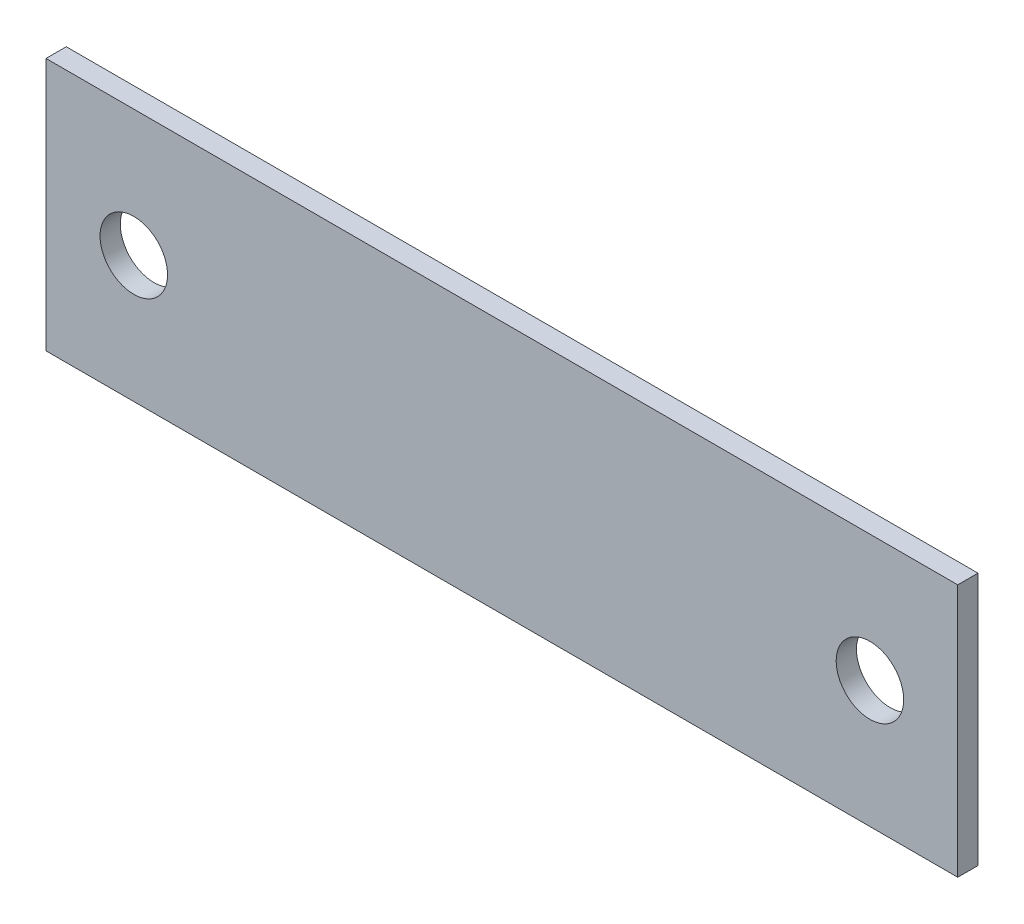
ISO-10303-21;
HEADER;
FILE_DESCRIPTION(('STEP AP214'),'2;1');
FILE_NAME('part.step','',(''),(''),'','','');
FILE_SCHEMA(('AUTOMOTIVE_DESIGN { 1 0 10303 214 1 1 1 1 }'));
ENDSEC;
DATA;
#1=APPLICATION_CONTEXT('core data for automotive mechanical design processes');
#2=APPLICATION_PROTOCOL_DEFINITION('international standard','automotive_design',2000,#1);
#3=PRODUCT_CONTEXT('',#1,'mechanical');
#4=PRODUCT('Part','Part','',(#3));
#5=PRODUCT_RELATED_PRODUCT_CATEGORY('part','',(#4));
#6=PRODUCT_DEFINITION_FORMATION('','',#4);
#7=PRODUCT_DEFINITION_CONTEXT('part definition',#1,'design');
#8=PRODUCT_DEFINITION('design','',#6,#7);
#9=PRODUCT_DEFINITION_SHAPE('','',#8);
#10=(LENGTH_UNIT() NAMED_UNIT(*) SI_UNIT(.MILLI.,.METRE.));
#11=(NAMED_UNIT(*) PLANE_ANGLE_UNIT() SI_UNIT($,.RADIAN.));
#12=(NAMED_UNIT(*) SI_UNIT($,.STERADIAN.) SOLID_ANGLE_UNIT());
#13=UNCERTAINTY_MEASURE_WITH_UNIT(LENGTH_MEASURE(1.E-05),#10,'distance_accuracy_value','');
#14=(GEOMETRIC_REPRESENTATION_CONTEXT(3) GLOBAL_UNCERTAINTY_ASSIGNED_CONTEXT((#13)) GLOBAL_UNIT_ASSIGNED_CONTEXT((#10,
#11,#12)) REPRESENTATION_CONTEXT('',''));
#15=CARTESIAN_POINT('',(0.,0.,0.));
#16=DIRECTION('',(0.,0.,1.));
#17=DIRECTION('',(1.,0.,0.));
#18=AXIS2_PLACEMENT_3D('',#15,#16,#17);
#19=CARTESIAN_POINT('',(27.,-7.5,1.2));
#20=DIRECTION('',(-1.,0.,0.));
#21=DIRECTION('',(0.,0.,1.));
#22=AXIS2_PLACEMENT_3D('',#19,#20,#21);
#23=PLANE('',#22);
#24=DIRECTION('',(0.,1.,0.));
#25=VECTOR('',#24,1.);
#26=CARTESIAN_POINT('',(27.,-7.5,0.));
#27=LINE('',#26,#25);
#28=CARTESIAN_POINT('',(27.,-7.5,0.));
#29=VERTEX_POINT('',#28);
#30=CARTESIAN_POINT('',(27.,7.5,0.));
#31=VERTEX_POINT('',#30);
#32=EDGE_CURVE('E110',#29,#31,#27,.T.);
#33=ORIENTED_EDGE('',*,*,#32,.T.);
#34=DIRECTION('',(0.,0.,-1.));
#35=VECTOR('',#34,1.);
#36=CARTESIAN_POINT('',(27.,7.5,1.2));
#37=LINE('',#36,#35);
#38=CARTESIAN_POINT('',(27.,7.5,1.2));
#39=VERTEX_POINT('',#38);
#40=EDGE_CURVE('E11',#39,#31,#37,.T.);
#41=ORIENTED_EDGE('',*,*,#40,.F.);
#42=DIRECTION('',(0.,1.,0.));
#43=VECTOR('',#42,1.);
#44=CARTESIAN_POINT('',(27.,-7.5,1.2));
#45=LINE('',#44,#43);
#46=CARTESIAN_POINT('',(27.,-7.5,1.2));
#47=VERTEX_POINT('',#46);
#48=EDGE_CURVE('E93',#47,#39,#45,.T.);
#49=ORIENTED_EDGE('',*,*,#48,.F.);
#50=DIRECTION('',(0.,0.,-1.));
#51=VECTOR('',#50,1.);
#52=CARTESIAN_POINT('',(27.,-7.5,1.2));
#53=LINE('',#52,#51);
#54=EDGE_CURVE('E106',#47,#29,#53,.T.);
#55=ORIENTED_EDGE('',*,*,#54,.T.);
#56=EDGE_LOOP('',(#33,#41,#49,#55));
#57=FACE_BOUND('',#56,.T.);
#58=ADVANCED_FACE('F39',(#57),#23,.F.);
#59=CARTESIAN_POINT('',(-27.,7.5,1.2));
#60=DIRECTION('',(0.,-1.,0.));
#61=DIRECTION('',(0.,0.,-1.));
#62=AXIS2_PLACEMENT_3D('',#59,#60,#61);
#63=PLANE('',#62);
#64=DIRECTION('',(-1.,0.,0.));
#65=VECTOR('',#64,1.);
#66=CARTESIAN_POINT('',(-27.,7.5,0.));
#67=LINE('',#66,#65);
#68=CARTESIAN_POINT('',(-27.,7.5,0.));
#69=VERTEX_POINT('',#68);
#70=EDGE_CURVE('E98',#31,#69,#67,.T.);
#71=ORIENTED_EDGE('',*,*,#70,.T.);
#72=DIRECTION('',(0.,0.,-1.));
#73=VECTOR('',#72,1.);
#74=CARTESIAN_POINT('',(-27.,7.5,1.2));
#75=LINE('',#74,#73);
#76=CARTESIAN_POINT('',(-27.,7.5,1.2));
#77=VERTEX_POINT('',#76);
#78=EDGE_CURVE('E49',#77,#69,#75,.T.);
#79=ORIENTED_EDGE('',*,*,#78,.F.);
#80=DIRECTION('',(-1.,0.,0.));
#81=VECTOR('',#80,1.);
#82=CARTESIAN_POINT('',(-27.,7.5,1.2));
#83=LINE('',#82,#81);
#84=EDGE_CURVE('E88',#39,#77,#83,.T.);
#85=ORIENTED_EDGE('',*,*,#84,.F.);
#86=ORIENTED_EDGE('',*,*,#40,.T.);
#87=EDGE_LOOP('',(#71,#79,#85,#86));
#88=FACE_BOUND('',#87,.T.);
#89=ADVANCED_FACE('F97',(#88),#63,.F.);
#90=CARTESIAN_POINT('',(-27.,-7.5,1.2));
#91=DIRECTION('',(1.,0.,0.));
#92=DIRECTION('',(0.,0.,-1.));
#93=AXIS2_PLACEMENT_3D('',#90,#91,#92);
#94=PLANE('',#93);
#95=DIRECTION('',(0.,-1.,0.));
#96=VECTOR('',#95,1.);
#97=CARTESIAN_POINT('',(-27.,-7.5,0.));
#98=LINE('',#97,#96);
#99=CARTESIAN_POINT('',(-27.,-7.5,0.));
#100=VERTEX_POINT('',#99);
#101=EDGE_CURVE('E75',#69,#100,#98,.T.);
#102=ORIENTED_EDGE('',*,*,#101,.T.);
#103=DIRECTION('',(0.,0.,-1.));
#104=VECTOR('',#103,1.);
#105=CARTESIAN_POINT('',(-27.,-7.5,1.2));
#106=LINE('',#105,#104);
#107=CARTESIAN_POINT('',(-27.,-7.5,1.2));
#108=VERTEX_POINT('',#107);
#109=EDGE_CURVE('E100',#108,#100,#106,.T.);
#110=ORIENTED_EDGE('',*,*,#109,.F.);
#111=DIRECTION('',(0.,-1.,0.));
#112=VECTOR('',#111,1.);
#113=CARTESIAN_POINT('',(-27.,-7.5,1.2));
#114=LINE('',#113,#112);
#115=EDGE_CURVE('E91',#77,#108,#114,.T.);
#116=ORIENTED_EDGE('',*,*,#115,.F.);
#117=ORIENTED_EDGE('',*,*,#78,.T.);
#118=EDGE_LOOP('',(#102,#110,#116,#117));
#119=FACE_BOUND('',#118,.T.);
#120=ADVANCED_FACE('F102',(#119),#94,.F.);
#121=CARTESIAN_POINT('',(-27.,-7.5,1.2));
#122=DIRECTION('',(0.,1.,0.));
#123=DIRECTION('',(0.,0.,1.));
#124=AXIS2_PLACEMENT_3D('',#121,#122,#123);
#125=PLANE('',#124);
#126=DIRECTION('',(1.,0.,0.));
#127=VECTOR('',#126,1.);
#128=CARTESIAN_POINT('',(-27.,-7.5,0.));
#129=LINE('',#128,#127);
#130=EDGE_CURVE('E81',#100,#29,#129,.T.);
#131=ORIENTED_EDGE('',*,*,#130,.T.);
#132=ORIENTED_EDGE('',*,*,#54,.F.);
#133=DIRECTION('',(1.,0.,0.));
#134=VECTOR('',#133,1.);
#135=CARTESIAN_POINT('',(-27.,-7.5,1.2));
#136=LINE('',#135,#134);
#137=EDGE_CURVE('E58',#108,#47,#136,.T.);
#138=ORIENTED_EDGE('',*,*,#137,.F.);
#139=ORIENTED_EDGE('',*,*,#109,.T.);
#140=EDGE_LOOP('',(#131,#132,#138,#139));
#141=FACE_BOUND('',#140,.T.);
#142=ADVANCED_FACE('F148',(#141),#125,.F.);
#143=CARTESIAN_POINT('',(0.,0.,1.2));
#144=DIRECTION('',(0.,0.,-1.));
#145=DIRECTION('',(-1.,0.,0.));
#146=AXIS2_PLACEMENT_3D('',#143,#144,#145);
#147=PLANE('',#146);
#148=CARTESIAN_POINT('',(-21.8,0.,1.2));
#149=DIRECTION('',(0.,0.,-1.));
#150=DIRECTION('',(-1.,0.,0.));
#151=AXIS2_PLACEMENT_3D('',#148,#149,#150);
#152=CIRCLE('',#151,2.);
#153=CARTESIAN_POINT('',(-23.8,0.,1.2));
#154=VERTEX_POINT('',#153);
#155=EDGE_CURVE('E114',#154,#154,#152,.F.);
#156=ORIENTED_EDGE('',*,*,#155,.F.);
#157=EDGE_LOOP('',(#156));
#158=FACE_BOUND('',#157,.T.);
#159=CARTESIAN_POINT('',(21.8,0.,1.2));
#160=DIRECTION('',(0.,0.,-1.));
#161=DIRECTION('',(-1.,0.,0.));
#162=AXIS2_PLACEMENT_3D('',#159,#160,#161);
#163=CIRCLE('',#162,2.);
#164=CARTESIAN_POINT('',(19.8,0.,1.2));
#165=VERTEX_POINT('',#164);
#166=EDGE_CURVE('E127',#165,#165,#163,.F.);
#167=ORIENTED_EDGE('',*,*,#166,.F.);
#168=EDGE_LOOP('',(#167));
#169=FACE_BOUND('',#168,.T.);
#170=ORIENTED_EDGE('',*,*,#48,.T.);
#171=ORIENTED_EDGE('',*,*,#84,.T.);
#172=ORIENTED_EDGE('',*,*,#115,.T.);
#173=ORIENTED_EDGE('',*,*,#137,.T.);
#174=EDGE_LOOP('',(#170,#171,#172,#173));
#175=FACE_BOUND('',#174,.T.);
#176=ADVANCED_FACE('F89',(#158,#169,#175),#147,.F.);
#177=CARTESIAN_POINT('',(0.,0.,0.));
#178=DIRECTION('',(0.,0.,-1.));
#179=DIRECTION('',(-1.,0.,0.));
#180=AXIS2_PLACEMENT_3D('',#177,#178,#179);
#181=PLANE('',#180);
#182=CARTESIAN_POINT('',(-21.8,0.,0.));
#183=DIRECTION('',(0.,0.,-1.));
#184=DIRECTION('',(-1.,0.,0.));
#185=AXIS2_PLACEMENT_3D('',#182,#183,#184);
#186=CIRCLE('',#185,2.);
#187=CARTESIAN_POINT('',(-23.8,0.,0.));
#188=VERTEX_POINT('',#187);
#189=EDGE_CURVE('E42',#188,#188,#186,.F.);
#190=ORIENTED_EDGE('',*,*,#189,.T.);
#191=EDGE_LOOP('',(#190));
#192=FACE_BOUND('',#191,.T.);
#193=CARTESIAN_POINT('',(21.8,0.,0.));
#194=DIRECTION('',(0.,0.,-1.));
#195=DIRECTION('',(-1.,0.,0.));
#196=AXIS2_PLACEMENT_3D('',#193,#194,#195);
#197=CIRCLE('',#196,2.);
#198=CARTESIAN_POINT('',(19.8,0.,0.));
#199=VERTEX_POINT('',#198);
#200=EDGE_CURVE('E124',#199,#199,#197,.F.);
#201=ORIENTED_EDGE('',*,*,#200,.T.);
#202=EDGE_LOOP('',(#201));
#203=FACE_BOUND('',#202,.T.);
#204=ORIENTED_EDGE('',*,*,#32,.F.);
#205=ORIENTED_EDGE('',*,*,#130,.F.);
#206=ORIENTED_EDGE('',*,*,#101,.F.);
#207=ORIENTED_EDGE('',*,*,#70,.F.);
#208=EDGE_LOOP('',(#204,#205,#206,#207));
#209=FACE_BOUND('',#208,.T.);
#210=ADVANCED_FACE('F147',(#192,#203,#209),#181,.T.);
#211=CARTESIAN_POINT('',(21.8,0.,5.));
#212=DIRECTION('',(0.,0.,-1.));
#213=DIRECTION('',(-1.,0.,0.));
#214=AXIS2_PLACEMENT_3D('',#211,#212,#213);
#215=CYLINDRICAL_SURFACE('',#214,2.);
#216=ORIENTED_EDGE('',*,*,#200,.F.);
#217=EDGE_LOOP('',(#216));
#218=FACE_BOUND('',#217,.T.);
#219=ORIENTED_EDGE('',*,*,#166,.T.);
#220=EDGE_LOOP('',(#219));
#221=FACE_BOUND('',#220,.T.);
#222=ADVANCED_FACE('F154',(#218,#221),#215,.F.);
#223=CARTESIAN_POINT('',(-21.8,0.,5.));
#224=DIRECTION('',(0.,0.,-1.));
#225=DIRECTION('',(-1.,0.,0.));
#226=AXIS2_PLACEMENT_3D('',#223,#224,#225);
#227=CYLINDRICAL_SURFACE('',#226,2.);
#228=ORIENTED_EDGE('',*,*,#189,.F.);
#229=EDGE_LOOP('',(#228));
#230=FACE_BOUND('',#229,.T.);
#231=ORIENTED_EDGE('',*,*,#155,.T.);
#232=EDGE_LOOP('',(#231));
#233=FACE_BOUND('',#232,.T.);
#234=ADVANCED_FACE('F143',(#230,#233),#227,.F.);
#235=CLOSED_SHELL('',(#58,#89,#120,#142,#176,#210,#222,#234));
#236=MANIFOLD_SOLID_BREP('B2',#235);
#237=ADVANCED_BREP_SHAPE_REPRESENTATION('',(#18,#236),#14);
#238=SHAPE_DEFINITION_REPRESENTATION(#9,#237);
ENDSEC;
END-ISO-10303-21;
